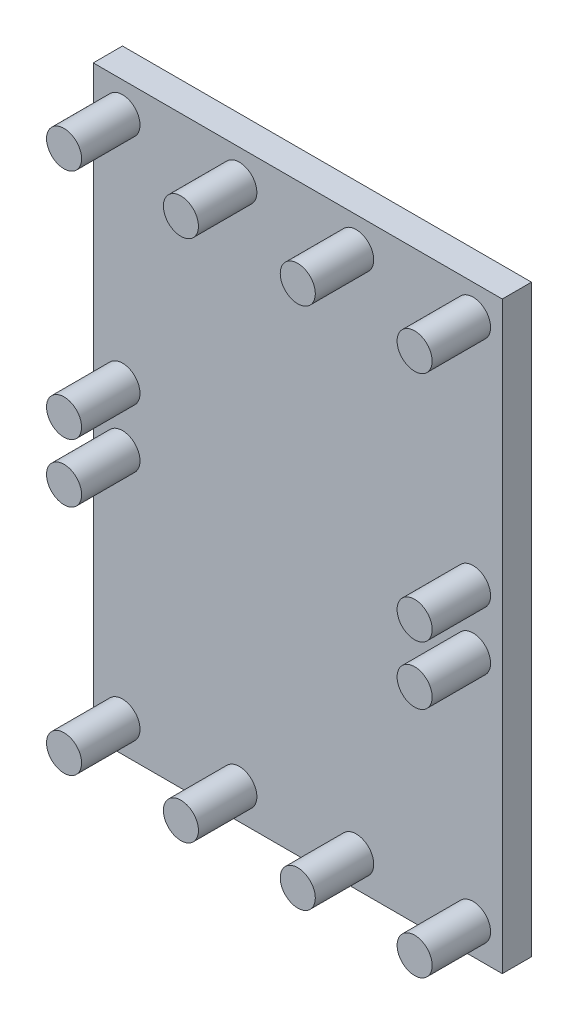
ISO-10303-21;
HEADER;
FILE_DESCRIPTION(('STEP AP214'),'2;1');
FILE_NAME('part.step','',(''),(''),'','','');
FILE_SCHEMA(('AUTOMOTIVE_DESIGN { 1 0 10303 214 1 1 1 1 }'));
ENDSEC;
DATA;
#1=APPLICATION_CONTEXT('core data for automotive mechanical design processes');
#2=APPLICATION_PROTOCOL_DEFINITION('international standard','automotive_design',2000,#1);
#3=PRODUCT_CONTEXT('',#1,'mechanical');
#4=PRODUCT('Part','Part','',(#3));
#5=PRODUCT_RELATED_PRODUCT_CATEGORY('part','',(#4));
#6=PRODUCT_DEFINITION_FORMATION('','',#4);
#7=PRODUCT_DEFINITION_CONTEXT('part definition',#1,'design');
#8=PRODUCT_DEFINITION('design','',#6,#7);
#9=PRODUCT_DEFINITION_SHAPE('','',#8);
#10=(LENGTH_UNIT() NAMED_UNIT(*) SI_UNIT(.MILLI.,.METRE.));
#11=(NAMED_UNIT(*) PLANE_ANGLE_UNIT() SI_UNIT($,.RADIAN.));
#12=(NAMED_UNIT(*) SI_UNIT($,.STERADIAN.) SOLID_ANGLE_UNIT());
#13=UNCERTAINTY_MEASURE_WITH_UNIT(LENGTH_MEASURE(1.E-05),#10,'distance_accuracy_value','');
#14=(GEOMETRIC_REPRESENTATION_CONTEXT(3) GLOBAL_UNCERTAINTY_ASSIGNED_CONTEXT((#13)) GLOBAL_UNIT_ASSIGNED_CONTEXT((#10,
#11,#12)) REPRESENTATION_CONTEXT('',''));
#15=CARTESIAN_POINT('',(0.,0.,0.));
#16=DIRECTION('',(0.,0.,1.));
#17=DIRECTION('',(1.,0.,0.));
#18=AXIS2_PLACEMENT_3D('',#15,#16,#17);
#19=CARTESIAN_POINT('',(-56.,0.,4.));
#20=DIRECTION('',(0.,1.,0.));
#21=DIRECTION('',(0.,0.,1.));
#22=AXIS2_PLACEMENT_3D('',#19,#20,#21);
#23=PLANE('',#22);
#24=DIRECTION('',(1.,0.,0.));
#25=VECTOR('',#24,1.);
#26=CARTESIAN_POINT('',(-56.,0.,0.));
#27=LINE('',#26,#25);
#28=CARTESIAN_POINT('',(-56.,0.,0.));
#29=VERTEX_POINT('',#28);
#30=CARTESIAN_POINT('',(0.,0.,0.));
#31=VERTEX_POINT('',#30);
#32=EDGE_CURVE('E107',#29,#31,#27,.T.);
#33=ORIENTED_EDGE('',*,*,#32,.T.);
#34=DIRECTION('',(0.,0.,-1.));
#35=VECTOR('',#34,1.);
#36=CARTESIAN_POINT('',(0.,0.,4.));
#37=LINE('',#36,#35);
#38=CARTESIAN_POINT('',(0.,0.,4.));
#39=VERTEX_POINT('',#38);
#40=EDGE_CURVE('E45',#39,#31,#37,.T.);
#41=ORIENTED_EDGE('',*,*,#40,.F.);
#42=DIRECTION('',(1.,0.,0.));
#43=VECTOR('',#42,1.);
#44=CARTESIAN_POINT('',(-56.,0.,4.));
#45=LINE('',#44,#43);
#46=CARTESIAN_POINT('',(-56.,0.,4.));
#47=VERTEX_POINT('',#46);
#48=EDGE_CURVE('E93',#47,#39,#45,.T.);
#49=ORIENTED_EDGE('',*,*,#48,.F.);
#50=DIRECTION('',(0.,0.,-1.));
#51=VECTOR('',#50,1.);
#52=CARTESIAN_POINT('',(-56.,0.,4.));
#53=LINE('',#52,#51);
#54=EDGE_CURVE('E105',#47,#29,#53,.T.);
#55=ORIENTED_EDGE('',*,*,#54,.T.);
#56=EDGE_LOOP('',(#33,#41,#49,#55));
#57=FACE_BOUND('',#56,.T.);
#58=ADVANCED_FACE('F39',(#57),#23,.F.);
#59=CARTESIAN_POINT('',(0.,0.,4.));
#60=DIRECTION('',(-1.,0.,0.));
#61=DIRECTION('',(0.,0.,1.));
#62=AXIS2_PLACEMENT_3D('',#59,#60,#61);
#63=PLANE('',#62);
#64=DIRECTION('',(0.,1.,0.));
#65=VECTOR('',#64,1.);
#66=CARTESIAN_POINT('',(0.,0.,0.));
#67=LINE('',#66,#65);
#68=CARTESIAN_POINT('',(0.,80.,0.));
#69=VERTEX_POINT('',#68);
#70=EDGE_CURVE('E97',#31,#69,#67,.T.);
#71=ORIENTED_EDGE('',*,*,#70,.T.);
#72=DIRECTION('',(0.,0.,-1.));
#73=VECTOR('',#72,1.);
#74=CARTESIAN_POINT('',(0.,80.,4.));
#75=LINE('',#74,#73);
#76=CARTESIAN_POINT('',(0.,80.,4.));
#77=VERTEX_POINT('',#76);
#78=EDGE_CURVE('E96',#77,#69,#75,.T.);
#79=ORIENTED_EDGE('',*,*,#78,.F.);
#80=DIRECTION('',(0.,1.,0.));
#81=VECTOR('',#80,1.);
#82=CARTESIAN_POINT('',(0.,0.,4.));
#83=LINE('',#82,#81);
#84=EDGE_CURVE('E88',#39,#77,#83,.T.);
#85=ORIENTED_EDGE('',*,*,#84,.F.);
#86=ORIENTED_EDGE('',*,*,#40,.T.);
#87=EDGE_LOOP('',(#71,#79,#85,#86));
#88=FACE_BOUND('',#87,.T.);
#89=ADVANCED_FACE('F100',(#88),#63,.F.);
#90=CARTESIAN_POINT('',(0.,80.,4.));
#91=DIRECTION('',(0.,-1.,0.));
#92=DIRECTION('',(0.,0.,-1.));
#93=AXIS2_PLACEMENT_3D('',#90,#91,#92);
#94=PLANE('',#93);
#95=DIRECTION('',(-1.,0.,0.));
#96=VECTOR('',#95,1.);
#97=CARTESIAN_POINT('',(0.,80.,0.));
#98=LINE('',#97,#96);
#99=CARTESIAN_POINT('',(-56.,80.,0.));
#100=VERTEX_POINT('',#99);
#101=EDGE_CURVE('E74',#69,#100,#98,.T.);
#102=ORIENTED_EDGE('',*,*,#101,.T.);
#103=DIRECTION('',(0.,0.,-1.));
#104=VECTOR('',#103,1.);
#105=CARTESIAN_POINT('',(-56.,80.,4.));
#106=LINE('',#105,#104);
#107=CARTESIAN_POINT('',(-56.,80.,4.));
#108=VERTEX_POINT('',#107);
#109=EDGE_CURVE('E98',#108,#100,#106,.T.);
#110=ORIENTED_EDGE('',*,*,#109,.F.);
#111=DIRECTION('',(-1.,0.,0.));
#112=VECTOR('',#111,1.);
#113=CARTESIAN_POINT('',(0.,80.,4.));
#114=LINE('',#113,#112);
#115=EDGE_CURVE('E91',#77,#108,#114,.T.);
#116=ORIENTED_EDGE('',*,*,#115,.F.);
#117=ORIENTED_EDGE('',*,*,#78,.T.);
#118=EDGE_LOOP('',(#102,#110,#116,#117));
#119=FACE_BOUND('',#118,.T.);
#120=ADVANCED_FACE('F99',(#119),#94,.F.);
#121=CARTESIAN_POINT('',(-56.,80.,4.));
#122=DIRECTION('',(1.,0.,0.));
#123=DIRECTION('',(0.,0.,-1.));
#124=AXIS2_PLACEMENT_3D('',#121,#122,#123);
#125=PLANE('',#124);
#126=DIRECTION('',(0.,-1.,0.));
#127=VECTOR('',#126,1.);
#128=CARTESIAN_POINT('',(-56.,80.,0.));
#129=LINE('',#128,#127);
#130=EDGE_CURVE('E79',#100,#29,#129,.T.);
#131=ORIENTED_EDGE('',*,*,#130,.T.);
#132=ORIENTED_EDGE('',*,*,#54,.F.);
#133=DIRECTION('',(0.,-1.,0.));
#134=VECTOR('',#133,1.);
#135=CARTESIAN_POINT('',(-56.,80.,4.));
#136=LINE('',#135,#134);
#137=EDGE_CURVE('E60',#108,#47,#136,.T.);
#138=ORIENTED_EDGE('',*,*,#137,.F.);
#139=ORIENTED_EDGE('',*,*,#109,.T.);
#140=EDGE_LOOP('',(#131,#132,#138,#139));
#141=FACE_BOUND('',#140,.T.);
#142=ADVANCED_FACE('F114',(#141),#125,.F.);
#143=CARTESIAN_POINT('',(0.,0.,4.));
#144=DIRECTION('',(0.,0.,1.));
#145=DIRECTION('',(1.,0.,0.));
#146=AXIS2_PLACEMENT_3D('',#143,#144,#145);
#147=PLANE('',#146);
#148=CARTESIAN_POINT('',(-4.,44.,4.));
#149=DIRECTION('',(0.,0.,1.));
#150=DIRECTION('',(-1.,0.,0.));
#151=AXIS2_PLACEMENT_3D('',#148,#149,#150);
#152=CIRCLE('',#151,2.4);
#153=CARTESIAN_POINT('',(-6.4,44.,4.));
#154=VERTEX_POINT('',#153);
#155=EDGE_CURVE('E11',#154,#154,#152,.T.);
#156=ORIENTED_EDGE('',*,*,#155,.F.);
#157=EDGE_LOOP('',(#156));
#158=FACE_BOUND('',#157,.T.);
#159=CARTESIAN_POINT('',(-4.,75.8278155217657,4.));
#160=DIRECTION('',(0.,0.,1.));
#161=DIRECTION('',(-1.,0.,0.));
#162=AXIS2_PLACEMENT_3D('',#159,#160,#161);
#163=CIRCLE('',#162,2.4);
#164=CARTESIAN_POINT('',(-6.4,75.8278155217657,4.));
#165=VERTEX_POINT('',#164);
#166=EDGE_CURVE('E48',#165,#165,#163,.T.);
#167=ORIENTED_EDGE('',*,*,#166,.F.);
#168=EDGE_LOOP('',(#167));
#169=FACE_BOUND('',#168,.T.);
#170=CARTESIAN_POINT('',(-20.,75.8278155217657,4.));
#171=DIRECTION('',(0.,0.,1.));
#172=DIRECTION('',(-1.,0.,0.));
#173=AXIS2_PLACEMENT_3D('',#170,#171,#172);
#174=CIRCLE('',#173,2.4);
#175=CARTESIAN_POINT('',(-22.4,75.8278155217657,4.));
#176=VERTEX_POINT('',#175);
#177=EDGE_CURVE('E163',#176,#176,#174,.T.);
#178=ORIENTED_EDGE('',*,*,#177,.F.);
#179=EDGE_LOOP('',(#178));
#180=FACE_BOUND('',#179,.T.);
#181=CARTESIAN_POINT('',(-36.,75.8278155217657,4.));
#182=DIRECTION('',(0.,0.,1.));
#183=DIRECTION('',(-1.,0.,0.));
#184=AXIS2_PLACEMENT_3D('',#181,#182,#183);
#185=CIRCLE('',#184,2.4);
#186=CARTESIAN_POINT('',(-38.4,75.8278155217657,4.));
#187=VERTEX_POINT('',#186);
#188=EDGE_CURVE('E139',#187,#187,#185,.T.);
#189=ORIENTED_EDGE('',*,*,#188,.F.);
#190=EDGE_LOOP('',(#189));
#191=FACE_BOUND('',#190,.T.);
#192=CARTESIAN_POINT('',(-52.,75.8278155217657,4.));
#193=DIRECTION('',(0.,0.,1.));
#194=DIRECTION('',(-1.,0.,0.));
#195=AXIS2_PLACEMENT_3D('',#192,#193,#194);
#196=CIRCLE('',#195,2.4);
#197=CARTESIAN_POINT('',(-54.4,75.8278155217657,4.));
#198=VERTEX_POINT('',#197);
#199=EDGE_CURVE('E132',#198,#198,#196,.T.);
#200=ORIENTED_EDGE('',*,*,#199,.F.);
#201=EDGE_LOOP('',(#200));
#202=FACE_BOUND('',#201,.T.);
#203=CARTESIAN_POINT('',(-20.,4.1721844782343,4.));
#204=DIRECTION('',(0.,0.,1.));
#205=DIRECTION('',(1.,0.,0.));
#206=AXIS2_PLACEMENT_3D('',#203,#204,#205);
#207=CIRCLE('',#206,2.4);
#208=CARTESIAN_POINT('',(-17.6,4.1721844782343,4.));
#209=VERTEX_POINT('',#208);
#210=EDGE_CURVE('E131',#209,#209,#207,.T.);
#211=ORIENTED_EDGE('',*,*,#210,.F.);
#212=EDGE_LOOP('',(#211));
#213=FACE_BOUND('',#212,.T.);
#214=CARTESIAN_POINT('',(-36.,4.1721844782343,4.));
#215=DIRECTION('',(0.,0.,1.));
#216=DIRECTION('',(1.,0.,0.));
#217=AXIS2_PLACEMENT_3D('',#214,#215,#216);
#218=CIRCLE('',#217,2.4);
#219=CARTESIAN_POINT('',(-33.6,4.1721844782343,4.));
#220=VERTEX_POINT('',#219);
#221=EDGE_CURVE('E134',#220,#220,#218,.T.);
#222=ORIENTED_EDGE('',*,*,#221,.F.);
#223=EDGE_LOOP('',(#222));
#224=FACE_BOUND('',#223,.T.);
#225=CARTESIAN_POINT('',(-52.,4.1721844782343,4.));
#226=DIRECTION('',(0.,0.,1.));
#227=DIRECTION('',(1.,0.,0.));
#228=AXIS2_PLACEMENT_3D('',#225,#226,#227);
#229=CIRCLE('',#228,2.4);
#230=CARTESIAN_POINT('',(-49.6,4.1721844782343,4.));
#231=VERTEX_POINT('',#230);
#232=EDGE_CURVE('E144',#231,#231,#229,.T.);
#233=ORIENTED_EDGE('',*,*,#232,.F.);
#234=EDGE_LOOP('',(#233));
#235=FACE_BOUND('',#234,.T.);
#236=CARTESIAN_POINT('',(-52.,36.,4.));
#237=DIRECTION('',(0.,0.,1.));
#238=DIRECTION('',(-1.,0.,0.));
#239=AXIS2_PLACEMENT_3D('',#236,#237,#238);
#240=CIRCLE('',#239,2.40000000000001);
#241=CARTESIAN_POINT('',(-54.4,36.,4.));
#242=VERTEX_POINT('',#241);
#243=EDGE_CURVE('E149',#242,#242,#240,.T.);
#244=ORIENTED_EDGE('',*,*,#243,.F.);
#245=EDGE_LOOP('',(#244));
#246=FACE_BOUND('',#245,.T.);
#247=CARTESIAN_POINT('',(-52.,44.,4.));
#248=DIRECTION('',(0.,0.,1.));
#249=DIRECTION('',(1.,0.,0.));
#250=AXIS2_PLACEMENT_3D('',#247,#248,#249);
#251=CIRCLE('',#250,2.40000000000001);
#252=CARTESIAN_POINT('',(-49.6,44.,4.));
#253=VERTEX_POINT('',#252);
#254=EDGE_CURVE('E176',#253,#253,#251,.T.);
#255=ORIENTED_EDGE('',*,*,#254,.F.);
#256=EDGE_LOOP('',(#255));
#257=FACE_BOUND('',#256,.T.);
#258=CARTESIAN_POINT('',(-4.,36.,4.));
#259=DIRECTION('',(0.,0.,1.));
#260=DIRECTION('',(1.,0.,0.));
#261=AXIS2_PLACEMENT_3D('',#258,#259,#260);
#262=CIRCLE('',#261,2.4);
#263=CARTESIAN_POINT('',(-1.6,36.,4.));
#264=VERTEX_POINT('',#263);
#265=EDGE_CURVE('E121',#264,#264,#262,.T.);
#266=ORIENTED_EDGE('',*,*,#265,.F.);
#267=EDGE_LOOP('',(#266));
#268=FACE_BOUND('',#267,.T.);
#269=CARTESIAN_POINT('',(-4.,4.1721844782343,4.));
#270=DIRECTION('',(0.,0.,1.));
#271=DIRECTION('',(1.,0.,0.));
#272=AXIS2_PLACEMENT_3D('',#269,#270,#271);
#273=CIRCLE('',#272,2.4);
#274=CARTESIAN_POINT('',(-1.6,4.1721844782343,4.));
#275=VERTEX_POINT('',#274);
#276=EDGE_CURVE('E116',#275,#275,#273,.T.);
#277=ORIENTED_EDGE('',*,*,#276,.F.);
#278=EDGE_LOOP('',(#277));
#279=FACE_BOUND('',#278,.T.);
#280=ORIENTED_EDGE('',*,*,#48,.T.);
#281=ORIENTED_EDGE('',*,*,#84,.T.);
#282=ORIENTED_EDGE('',*,*,#115,.T.);
#283=ORIENTED_EDGE('',*,*,#137,.T.);
#284=EDGE_LOOP('',(#280,#281,#282,#283));
#285=FACE_BOUND('',#284,.T.);
#286=ADVANCED_FACE('F87',(#158,#169,#180,#191,#202,#213,#224,#235,#246,#257,#268,#279,#285),
#147,.T.);
#287=CARTESIAN_POINT('',(0.,0.,0.));
#288=DIRECTION('',(0.,0.,1.));
#289=DIRECTION('',(1.,0.,0.));
#290=AXIS2_PLACEMENT_3D('',#287,#288,#289);
#291=PLANE('',#290);
#292=ORIENTED_EDGE('',*,*,#32,.F.);
#293=ORIENTED_EDGE('',*,*,#130,.F.);
#294=ORIENTED_EDGE('',*,*,#101,.F.);
#295=ORIENTED_EDGE('',*,*,#70,.F.);
#296=EDGE_LOOP('',(#292,#293,#294,#295));
#297=FACE_BOUND('',#296,.T.);
#298=ADVANCED_FACE('F120',(#297),#291,.F.);
#299=CARTESIAN_POINT('',(-4.,4.1721844782343,12.));
#300=DIRECTION('',(0.,0.,-1.));
#301=DIRECTION('',(-1.,0.,0.));
#302=AXIS2_PLACEMENT_3D('',#299,#300,#301);
#303=CYLINDRICAL_SURFACE('',#302,2.4);
#304=CARTESIAN_POINT('',(-4.,4.1721844782343,12.));
#305=DIRECTION('',(0.,0.,1.));
#306=DIRECTION('',(1.,0.,0.));
#307=AXIS2_PLACEMENT_3D('',#304,#305,#306);
#308=CIRCLE('',#307,2.4);
#309=CARTESIAN_POINT('',(-1.6,4.1721844782343,12.));
#310=VERTEX_POINT('',#309);
#311=EDGE_CURVE('E109',#310,#310,#308,.T.);
#312=ORIENTED_EDGE('',*,*,#311,.F.);
#313=EDGE_LOOP('',(#312));
#314=FACE_BOUND('',#313,.T.);
#315=ORIENTED_EDGE('',*,*,#276,.T.);
#316=EDGE_LOOP('',(#315));
#317=FACE_BOUND('',#316,.T.);
#318=ADVANCED_FACE('F196',(#314,#317),#303,.T.);
#319=CARTESIAN_POINT('',(-4.,4.1721844782343,12.));
#320=DIRECTION('',(0.,0.,1.));
#321=DIRECTION('',(1.,0.,0.));
#322=AXIS2_PLACEMENT_3D('',#319,#320,#321);
#323=PLANE('',#322);
#324=ORIENTED_EDGE('',*,*,#311,.T.);
#325=EDGE_LOOP('',(#324));
#326=FACE_BOUND('',#325,.T.);
#327=ADVANCED_FACE('F205',(#326),#323,.T.);
#328=CARTESIAN_POINT('',(-4.,36.,12.));
#329=DIRECTION('',(0.,0.,-1.));
#330=DIRECTION('',(-1.,0.,0.));
#331=AXIS2_PLACEMENT_3D('',#328,#329,#330);
#332=CYLINDRICAL_SURFACE('',#331,2.4);
#333=CARTESIAN_POINT('',(-4.,36.,12.));
#334=DIRECTION('',(0.,0.,1.));
#335=DIRECTION('',(1.,0.,0.));
#336=AXIS2_PLACEMENT_3D('',#333,#334,#335);
#337=CIRCLE('',#336,2.4);
#338=CARTESIAN_POINT('',(-1.6,36.,12.));
#339=VERTEX_POINT('',#338);
#340=EDGE_CURVE('E157',#339,#339,#337,.T.);
#341=ORIENTED_EDGE('',*,*,#340,.F.);
#342=EDGE_LOOP('',(#341));
#343=FACE_BOUND('',#342,.T.);
#344=ORIENTED_EDGE('',*,*,#265,.T.);
#345=EDGE_LOOP('',(#344));
#346=FACE_BOUND('',#345,.T.);
#347=ADVANCED_FACE('F208',(#343,#346),#332,.T.);
#348=CARTESIAN_POINT('',(-4.,36.,12.));
#349=DIRECTION('',(0.,0.,1.));
#350=DIRECTION('',(1.,0.,0.));
#351=AXIS2_PLACEMENT_3D('',#348,#349,#350);
#352=PLANE('',#351);
#353=ORIENTED_EDGE('',*,*,#340,.T.);
#354=EDGE_LOOP('',(#353));
#355=FACE_BOUND('',#354,.T.);
#356=ADVANCED_FACE('F260',(#355),#352,.T.);
#357=CARTESIAN_POINT('',(-52.,44.,12.));
#358=DIRECTION('',(0.,0.,-1.));
#359=DIRECTION('',(-1.,0.,0.));
#360=AXIS2_PLACEMENT_3D('',#357,#358,#359);
#361=CYLINDRICAL_SURFACE('',#360,2.40000000000001);
#362=CARTESIAN_POINT('',(-52.,44.,12.));
#363=DIRECTION('',(0.,0.,1.));
#364=DIRECTION('',(1.,0.,0.));
#365=AXIS2_PLACEMENT_3D('',#362,#363,#364);
#366=CIRCLE('',#365,2.40000000000001);
#367=CARTESIAN_POINT('',(-49.6,44.,12.));
#368=VERTEX_POINT('',#367);
#369=EDGE_CURVE('E175',#368,#368,#366,.T.);
#370=ORIENTED_EDGE('',*,*,#369,.F.);
#371=EDGE_LOOP('',(#370));
#372=FACE_BOUND('',#371,.T.);
#373=ORIENTED_EDGE('',*,*,#254,.T.);
#374=EDGE_LOOP('',(#373));
#375=FACE_BOUND('',#374,.T.);
#376=ADVANCED_FACE('F268',(#372,#375),#361,.T.);
#377=CARTESIAN_POINT('',(-52.,44.,12.));
#378=DIRECTION('',(0.,0.,1.));
#379=DIRECTION('',(1.,0.,0.));
#380=AXIS2_PLACEMENT_3D('',#377,#378,#379);
#381=PLANE('',#380);
#382=ORIENTED_EDGE('',*,*,#369,.T.);
#383=EDGE_LOOP('',(#382));
#384=FACE_BOUND('',#383,.T.);
#385=ADVANCED_FACE('F280',(#384),#381,.T.);
#386=CARTESIAN_POINT('',(-52.,36.,12.));
#387=DIRECTION('',(0.,0.,-1.));
#388=DIRECTION('',(-1.,0.,0.));
#389=AXIS2_PLACEMENT_3D('',#386,#387,#388);
#390=CYLINDRICAL_SURFACE('',#389,2.40000000000001);
#391=CARTESIAN_POINT('',(-52.,36.,12.));
#392=DIRECTION('',(0.,0.,1.));
#393=DIRECTION('',(-1.,0.,0.));
#394=AXIS2_PLACEMENT_3D('',#391,#392,#393);
#395=CIRCLE('',#394,2.40000000000001);
#396=CARTESIAN_POINT('',(-54.4,36.,12.));
#397=VERTEX_POINT('',#396);
#398=EDGE_CURVE('E172',#397,#397,#395,.T.);
#399=ORIENTED_EDGE('',*,*,#398,.F.);
#400=EDGE_LOOP('',(#399));
#401=FACE_BOUND('',#400,.T.);
#402=ORIENTED_EDGE('',*,*,#243,.T.);
#403=EDGE_LOOP('',(#402));
#404=FACE_BOUND('',#403,.T.);
#405=ADVANCED_FACE('F187',(#401,#404),#390,.T.);
#406=CARTESIAN_POINT('',(-52.,36.,12.));
#407=DIRECTION('',(0.,0.,-1.));
#408=DIRECTION('',(-1.,0.,0.));
#409=AXIS2_PLACEMENT_3D('',#406,#407,#408);
#410=PLANE('',#409);
#411=ORIENTED_EDGE('',*,*,#398,.T.);
#412=EDGE_LOOP('',(#411));
#413=FACE_BOUND('',#412,.T.);
#414=ADVANCED_FACE('F294',(#413),#410,.F.);
#415=CARTESIAN_POINT('',(-52.,4.1721844782343,12.));
#416=DIRECTION('',(0.,0.,-1.));
#417=DIRECTION('',(-1.,0.,0.));
#418=AXIS2_PLACEMENT_3D('',#415,#416,#417);
#419=CYLINDRICAL_SURFACE('',#418,2.4);
#420=CARTESIAN_POINT('',(-52.,4.1721844782343,12.));
#421=DIRECTION('',(0.,0.,1.));
#422=DIRECTION('',(1.,0.,0.));
#423=AXIS2_PLACEMENT_3D('',#420,#421,#422);
#424=CIRCLE('',#423,2.4);
#425=CARTESIAN_POINT('',(-49.6,4.1721844782343,12.));
#426=VERTEX_POINT('',#425);
#427=EDGE_CURVE('E141',#426,#426,#424,.T.);
#428=ORIENTED_EDGE('',*,*,#427,.F.);
#429=EDGE_LOOP('',(#428));
#430=FACE_BOUND('',#429,.T.);
#431=ORIENTED_EDGE('',*,*,#232,.T.);
#432=EDGE_LOOP('',(#431));
#433=FACE_BOUND('',#432,.T.);
#434=ADVANCED_FACE('F301',(#430,#433),#419,.T.);
#435=CARTESIAN_POINT('',(-52.,4.1721844782343,12.));
#436=DIRECTION('',(0.,0.,1.));
#437=DIRECTION('',(1.,0.,0.));
#438=AXIS2_PLACEMENT_3D('',#435,#436,#437);
#439=PLANE('',#438);
#440=ORIENTED_EDGE('',*,*,#427,.T.);
#441=EDGE_LOOP('',(#440));
#442=FACE_BOUND('',#441,.T.);
#443=ADVANCED_FACE('F315',(#442),#439,.T.);
#444=CARTESIAN_POINT('',(-36.,4.1721844782343,12.));
#445=DIRECTION('',(0.,0.,-1.));
#446=DIRECTION('',(-1.,0.,0.));
#447=AXIS2_PLACEMENT_3D('',#444,#445,#446);
#448=CYLINDRICAL_SURFACE('',#447,2.4);
#449=CARTESIAN_POINT('',(-36.,4.1721844782343,12.));
#450=DIRECTION('',(0.,0.,1.));
#451=DIRECTION('',(1.,0.,0.));
#452=AXIS2_PLACEMENT_3D('',#449,#450,#451);
#453=CIRCLE('',#452,2.4);
#454=CARTESIAN_POINT('',(-33.6,4.1721844782343,12.));
#455=VERTEX_POINT('',#454);
#456=EDGE_CURVE('E127',#455,#455,#453,.T.);
#457=ORIENTED_EDGE('',*,*,#456,.F.);
#458=EDGE_LOOP('',(#457));
#459=FACE_BOUND('',#458,.T.);
#460=ORIENTED_EDGE('',*,*,#221,.T.);
#461=EDGE_LOOP('',(#460));
#462=FACE_BOUND('',#461,.T.);
#463=ADVANCED_FACE('F321',(#459,#462),#448,.T.);
#464=CARTESIAN_POINT('',(-36.,4.1721844782343,12.));
#465=DIRECTION('',(0.,0.,1.));
#466=DIRECTION('',(1.,0.,0.));
#467=AXIS2_PLACEMENT_3D('',#464,#465,#466);
#468=PLANE('',#467);
#469=ORIENTED_EDGE('',*,*,#456,.T.);
#470=EDGE_LOOP('',(#469));
#471=FACE_BOUND('',#470,.T.);
#472=ADVANCED_FACE('F328',(#471),#468,.T.);
#473=CARTESIAN_POINT('',(-20.,4.1721844782343,12.));
#474=DIRECTION('',(0.,0.,-1.));
#475=DIRECTION('',(-1.,0.,0.));
#476=AXIS2_PLACEMENT_3D('',#473,#474,#475);
#477=CYLINDRICAL_SURFACE('',#476,2.4);
#478=CARTESIAN_POINT('',(-20.,4.1721844782343,12.));
#479=DIRECTION('',(0.,0.,1.));
#480=DIRECTION('',(1.,0.,0.));
#481=AXIS2_PLACEMENT_3D('',#478,#479,#480);
#482=CIRCLE('',#481,2.4);
#483=CARTESIAN_POINT('',(-17.6,4.1721844782343,12.));
#484=VERTEX_POINT('',#483);
#485=EDGE_CURVE('E130',#484,#484,#482,.T.);
#486=ORIENTED_EDGE('',*,*,#485,.F.);
#487=EDGE_LOOP('',(#486));
#488=FACE_BOUND('',#487,.T.);
#489=ORIENTED_EDGE('',*,*,#210,.T.);
#490=EDGE_LOOP('',(#489));
#491=FACE_BOUND('',#490,.T.);
#492=ADVANCED_FACE('F339',(#488,#491),#477,.T.);
#493=CARTESIAN_POINT('',(-20.,4.1721844782343,12.));
#494=DIRECTION('',(0.,0.,1.));
#495=DIRECTION('',(1.,0.,0.));
#496=AXIS2_PLACEMENT_3D('',#493,#494,#495);
#497=PLANE('',#496);
#498=ORIENTED_EDGE('',*,*,#485,.T.);
#499=EDGE_LOOP('',(#498));
#500=FACE_BOUND('',#499,.T.);
#501=ADVANCED_FACE('F346',(#500),#497,.T.);
#502=CARTESIAN_POINT('',(-52.,75.8278155217657,12.));
#503=DIRECTION('',(0.,0.,-1.));
#504=DIRECTION('',(-1.,0.,0.));
#505=AXIS2_PLACEMENT_3D('',#502,#503,#504);
#506=CYLINDRICAL_SURFACE('',#505,2.4);
#507=CARTESIAN_POINT('',(-52.,75.8278155217657,12.));
#508=DIRECTION('',(0.,0.,1.));
#509=DIRECTION('',(-1.,0.,0.));
#510=AXIS2_PLACEMENT_3D('',#507,#508,#509);
#511=CIRCLE('',#510,2.4);
#512=CARTESIAN_POINT('',(-54.4,75.8278155217657,12.));
#513=VERTEX_POINT('',#512);
#514=EDGE_CURVE('E128',#513,#513,#511,.T.);
#515=ORIENTED_EDGE('',*,*,#514,.F.);
#516=EDGE_LOOP('',(#515));
#517=FACE_BOUND('',#516,.T.);
#518=ORIENTED_EDGE('',*,*,#199,.T.);
#519=EDGE_LOOP('',(#518));
#520=FACE_BOUND('',#519,.T.);
#521=ADVANCED_FACE('F360',(#517,#520),#506,.T.);
#522=CARTESIAN_POINT('',(-52.,75.8278155217657,12.));
#523=DIRECTION('',(0.,0.,-1.));
#524=DIRECTION('',(-1.,0.,0.));
#525=AXIS2_PLACEMENT_3D('',#522,#523,#524);
#526=PLANE('',#525);
#527=ORIENTED_EDGE('',*,*,#514,.T.);
#528=EDGE_LOOP('',(#527));
#529=FACE_BOUND('',#528,.T.);
#530=ADVANCED_FACE('F366',(#529),#526,.F.);
#531=CARTESIAN_POINT('',(-36.,75.8278155217657,12.));
#532=DIRECTION('',(0.,0.,-1.));
#533=DIRECTION('',(-1.,0.,0.));
#534=AXIS2_PLACEMENT_3D('',#531,#532,#533);
#535=CYLINDRICAL_SURFACE('',#534,2.4);
#536=CARTESIAN_POINT('',(-36.,75.8278155217657,12.));
#537=DIRECTION('',(0.,0.,1.));
#538=DIRECTION('',(-1.,0.,0.));
#539=AXIS2_PLACEMENT_3D('',#536,#537,#538);
#540=CIRCLE('',#539,2.4);
#541=CARTESIAN_POINT('',(-38.4,75.8278155217657,12.));
#542=VERTEX_POINT('',#541);
#543=EDGE_CURVE('E143',#542,#542,#540,.T.);
#544=ORIENTED_EDGE('',*,*,#543,.F.);
#545=EDGE_LOOP('',(#544));
#546=FACE_BOUND('',#545,.T.);
#547=ORIENTED_EDGE('',*,*,#188,.T.);
#548=EDGE_LOOP('',(#547));
#549=FACE_BOUND('',#548,.T.);
#550=ADVANCED_FACE('F373',(#546,#549),#535,.T.);
#551=CARTESIAN_POINT('',(-36.,75.8278155217657,12.));
#552=DIRECTION('',(0.,0.,-1.));
#553=DIRECTION('',(-1.,0.,0.));
#554=AXIS2_PLACEMENT_3D('',#551,#552,#553);
#555=PLANE('',#554);
#556=ORIENTED_EDGE('',*,*,#543,.T.);
#557=EDGE_LOOP('',(#556));
#558=FACE_BOUND('',#557,.T.);
#559=ADVANCED_FACE('F384',(#558),#555,.F.);
#560=CARTESIAN_POINT('',(-20.,75.8278155217657,12.));
#561=DIRECTION('',(0.,0.,-1.));
#562=DIRECTION('',(-1.,0.,0.));
#563=AXIS2_PLACEMENT_3D('',#560,#561,#562);
#564=CYLINDRICAL_SURFACE('',#563,2.4);
#565=CARTESIAN_POINT('',(-20.,75.8278155217657,12.));
#566=DIRECTION('',(0.,0.,1.));
#567=DIRECTION('',(-1.,0.,0.));
#568=AXIS2_PLACEMENT_3D('',#565,#566,#567);
#569=CIRCLE('',#568,2.4);
#570=CARTESIAN_POINT('',(-22.4,75.8278155217657,12.));
#571=VERTEX_POINT('',#570);
#572=EDGE_CURVE('E158',#571,#571,#569,.T.);
#573=ORIENTED_EDGE('',*,*,#572,.F.);
#574=EDGE_LOOP('',(#573));
#575=FACE_BOUND('',#574,.T.);
#576=ORIENTED_EDGE('',*,*,#177,.T.);
#577=EDGE_LOOP('',(#576));
#578=FACE_BOUND('',#577,.T.);
#579=ADVANCED_FACE('F391',(#575,#578),#564,.T.);
#580=CARTESIAN_POINT('',(-20.,75.8278155217657,12.));
#581=DIRECTION('',(0.,0.,-1.));
#582=DIRECTION('',(-1.,0.,0.));
#583=AXIS2_PLACEMENT_3D('',#580,#581,#582);
#584=PLANE('',#583);
#585=ORIENTED_EDGE('',*,*,#572,.T.);
#586=EDGE_LOOP('',(#585));
#587=FACE_BOUND('',#586,.T.);
#588=ADVANCED_FACE('F405',(#587),#584,.F.);
#589=CARTESIAN_POINT('',(-4.,75.8278155217657,12.));
#590=DIRECTION('',(0.,0.,-1.));
#591=DIRECTION('',(-1.,0.,0.));
#592=AXIS2_PLACEMENT_3D('',#589,#590,#591);
#593=CYLINDRICAL_SURFACE('',#592,2.4);
#594=CARTESIAN_POINT('',(-4.,75.8278155217657,12.));
#595=DIRECTION('',(0.,0.,1.));
#596=DIRECTION('',(-1.,0.,0.));
#597=AXIS2_PLACEMENT_3D('',#594,#595,#596);
#598=CIRCLE('',#597,2.4);
#599=CARTESIAN_POINT('',(-6.4,75.8278155217657,12.));
#600=VERTEX_POINT('',#599);
#601=EDGE_CURVE('E151',#600,#600,#598,.T.);
#602=ORIENTED_EDGE('',*,*,#601,.F.);
#603=EDGE_LOOP('',(#602));
#604=FACE_BOUND('',#603,.T.);
#605=ORIENTED_EDGE('',*,*,#166,.T.);
#606=EDGE_LOOP('',(#605));
#607=FACE_BOUND('',#606,.T.);
#608=ADVANCED_FACE('F411',(#604,#607),#593,.T.);
#609=CARTESIAN_POINT('',(-4.,75.8278155217657,12.));
#610=DIRECTION('',(0.,0.,-1.));
#611=DIRECTION('',(-1.,0.,0.));
#612=AXIS2_PLACEMENT_3D('',#609,#610,#611);
#613=PLANE('',#612);
#614=ORIENTED_EDGE('',*,*,#601,.T.);
#615=EDGE_LOOP('',(#614));
#616=FACE_BOUND('',#615,.T.);
#617=ADVANCED_FACE('F418',(#616),#613,.F.);
#618=CARTESIAN_POINT('',(-4.,44.,12.));
#619=DIRECTION('',(0.,0.,-1.));
#620=DIRECTION('',(-1.,0.,0.));
#621=AXIS2_PLACEMENT_3D('',#618,#619,#620);
#622=CYLINDRICAL_SURFACE('',#621,2.4);
#623=CARTESIAN_POINT('',(-4.,44.,12.));
#624=DIRECTION('',(0.,0.,1.));
#625=DIRECTION('',(-1.,0.,0.));
#626=AXIS2_PLACEMENT_3D('',#623,#624,#625);
#627=CIRCLE('',#626,2.4);
#628=CARTESIAN_POINT('',(-6.4,44.,12.));
#629=VERTEX_POINT('',#628);
#630=EDGE_CURVE('E153',#629,#629,#627,.T.);
#631=ORIENTED_EDGE('',*,*,#630,.F.);
#632=EDGE_LOOP('',(#631));
#633=FACE_BOUND('',#632,.T.);
#634=ORIENTED_EDGE('',*,*,#155,.T.);
#635=EDGE_LOOP('',(#634));
#636=FACE_BOUND('',#635,.T.);
#637=ADVANCED_FACE('F429',(#633,#636),#622,.T.);
#638=CARTESIAN_POINT('',(-4.,44.,12.));
#639=DIRECTION('',(0.,0.,-1.));
#640=DIRECTION('',(-1.,0.,0.));
#641=AXIS2_PLACEMENT_3D('',#638,#639,#640);
#642=PLANE('',#641);
#643=ORIENTED_EDGE('',*,*,#630,.T.);
#644=EDGE_LOOP('',(#643));
#645=FACE_BOUND('',#644,.T.);
#646=ADVANCED_FACE('F436',(#645),#642,.F.);
#647=CLOSED_SHELL('',(#58,#89,#120,#142,#286,#298,#318,#327,#347,#356,#376,#385,#405,#414,#434,
#443,#463,#472,#492,#501,#521,#530,#550,#559,#579,#588,#608,#617,#637,#646));
#648=MANIFOLD_SOLID_BREP('B2',#647);
#649=ADVANCED_BREP_SHAPE_REPRESENTATION('',(#18,#648),#14);
#650=SHAPE_DEFINITION_REPRESENTATION(#9,#649);
ENDSEC;
END-ISO-10303-21;
